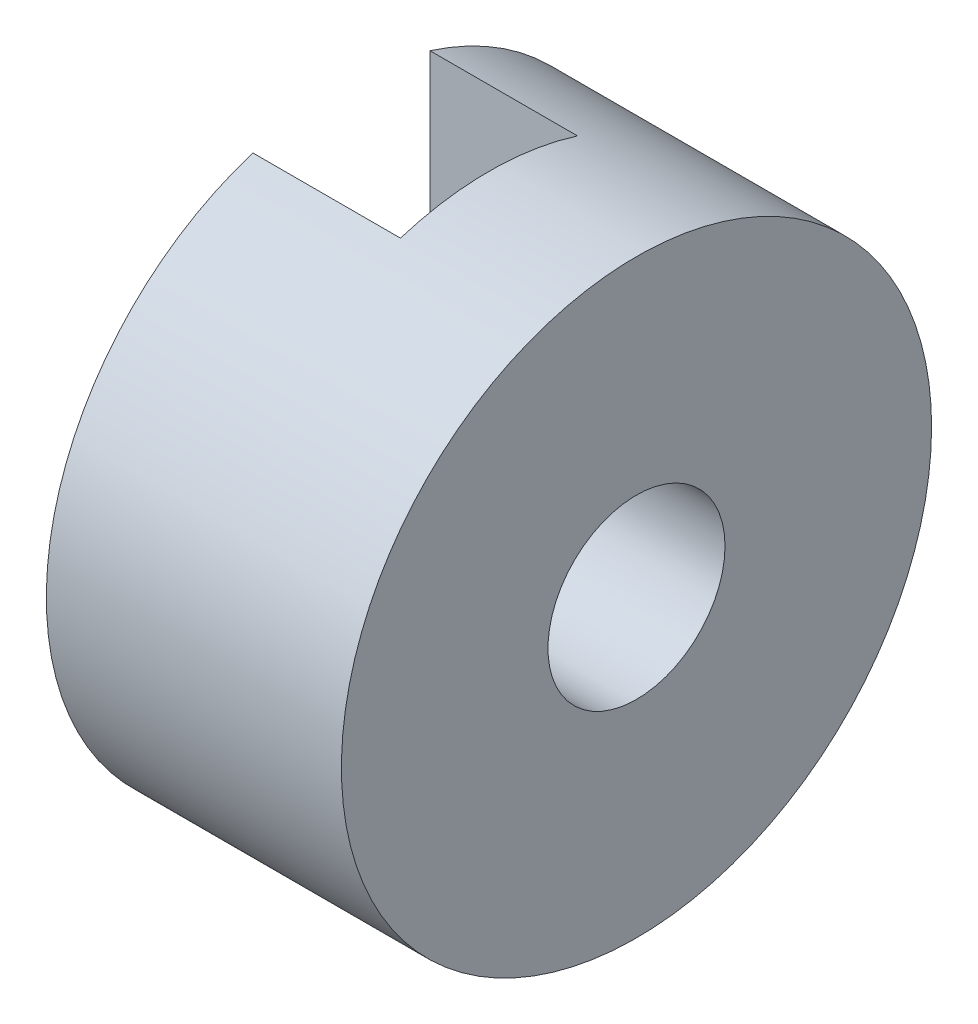
ISO-10303-21;
HEADER;
FILE_DESCRIPTION(('STEP AP214'),'2;1');
FILE_NAME('part.step','',(''),(''),'','','');
FILE_SCHEMA(('AUTOMOTIVE_DESIGN { 1 0 10303 214 1 1 1 1 }'));
ENDSEC;
DATA;
#1=APPLICATION_CONTEXT('core data for automotive mechanical design processes');
#2=APPLICATION_PROTOCOL_DEFINITION('international standard','automotive_design',2000,#1);
#3=PRODUCT_CONTEXT('',#1,'mechanical');
#4=PRODUCT('Part','Part','',(#3));
#5=PRODUCT_RELATED_PRODUCT_CATEGORY('part','',(#4));
#6=PRODUCT_DEFINITION_FORMATION('','',#4);
#7=PRODUCT_DEFINITION_CONTEXT('part definition',#1,'design');
#8=PRODUCT_DEFINITION('design','',#6,#7);
#9=PRODUCT_DEFINITION_SHAPE('','',#8);
#10=(LENGTH_UNIT() NAMED_UNIT(*) SI_UNIT(.MILLI.,.METRE.));
#11=(NAMED_UNIT(*) PLANE_ANGLE_UNIT() SI_UNIT($,.RADIAN.));
#12=(NAMED_UNIT(*) SI_UNIT($,.STERADIAN.) SOLID_ANGLE_UNIT());
#13=UNCERTAINTY_MEASURE_WITH_UNIT(LENGTH_MEASURE(1.E-05),#10,'distance_accuracy_value','');
#14=(GEOMETRIC_REPRESENTATION_CONTEXT(3) GLOBAL_UNCERTAINTY_ASSIGNED_CONTEXT((#13)) GLOBAL_UNIT_ASSIGNED_CONTEXT((#10,
#11,#12)) REPRESENTATION_CONTEXT('',''));
#15=CARTESIAN_POINT('',(0.,0.,0.));
#16=DIRECTION('',(0.,0.,1.));
#17=DIRECTION('',(1.,0.,0.));
#18=AXIS2_PLACEMENT_3D('',#15,#16,#17);
#19=CARTESIAN_POINT('',(10.,0.,0.));
#20=DIRECTION('',(1.,0.,0.));
#21=DIRECTION('',(0.,0.,-1.));
#22=AXIS2_PLACEMENT_3D('',#19,#20,#21);
#23=PLANE('',#22);
#24=CARTESIAN_POINT('',(10.,0.,0.));
#25=DIRECTION('',(1.,0.,0.));
#26=DIRECTION('',(0.,0.,-1.));
#27=AXIS2_PLACEMENT_3D('',#24,#25,#26);
#28=CIRCLE('',#27,10.);
#29=CARTESIAN_POINT('',(10.,0.,-10.));
#30=VERTEX_POINT('',#29);
#31=EDGE_CURVE('E52',#30,#30,#28,.T.);
#32=ORIENTED_EDGE('',*,*,#31,.T.);
#33=EDGE_LOOP('',(#32));
#34=FACE_BOUND('',#33,.T.);
#35=CARTESIAN_POINT('',(10.,0.,0.));
#36=DIRECTION('',(1.,0.,0.));
#37=DIRECTION('',(0.,0.,-1.));
#38=AXIS2_PLACEMENT_3D('',#35,#36,#37);
#39=CIRCLE('',#38,3.);
#40=CARTESIAN_POINT('',(10.,0.,-3.));
#41=VERTEX_POINT('',#40);
#42=EDGE_CURVE('E118',#41,#41,#39,.T.);
#43=ORIENTED_EDGE('',*,*,#42,.F.);
#44=EDGE_LOOP('',(#43));
#45=FACE_BOUND('',#44,.T.);
#46=ADVANCED_FACE('F43',(#34,#45),#23,.T.);
#47=CARTESIAN_POINT('',(0.,0.,0.));
#48=DIRECTION('',(1.,0.,0.));
#49=DIRECTION('',(0.,0.,-1.));
#50=AXIS2_PLACEMENT_3D('',#47,#48,#49);
#51=PLANE('',#50);
#52=CARTESIAN_POINT('',(0.,0.,0.));
#53=DIRECTION('',(1.,0.,0.));
#54=DIRECTION('',(0.,0.,-1.));
#55=AXIS2_PLACEMENT_3D('',#52,#53,#54);
#56=CIRCLE('',#55,10.);
#57=CARTESIAN_POINT('',(0.,9.53939201416946,3.));
#58=VERTEX_POINT('',#57);
#59=CARTESIAN_POINT('',(0.,9.53939201416946,-3.));
#60=VERTEX_POINT('',#59);
#61=EDGE_CURVE('E122',#58,#60,#56,.T.);
#62=ORIENTED_EDGE('',*,*,#61,.F.);
#63=DIRECTION('',(0.,1.,0.));
#64=VECTOR('',#63,1.);
#65=CARTESIAN_POINT('',(0.,10.,3.));
#66=LINE('',#65,#64);
#67=CARTESIAN_POINT('',(0.,0.,3.));
#68=VERTEX_POINT('',#67);
#69=EDGE_CURVE('E110',#68,#58,#66,.T.);
#70=ORIENTED_EDGE('',*,*,#69,.F.);
#71=CARTESIAN_POINT('',(0.,0.,0.));
#72=DIRECTION('',(1.,0.,0.));
#73=DIRECTION('',(0.,0.,-1.));
#74=AXIS2_PLACEMENT_3D('',#71,#72,#73);
#75=CIRCLE('',#74,3.);
#76=CARTESIAN_POINT('',(0.,0.,-3.));
#77=VERTEX_POINT('',#76);
#78=EDGE_CURVE('E101',#68,#77,#75,.T.);
#79=ORIENTED_EDGE('',*,*,#78,.T.);
#80=DIRECTION('',(0.,-1.,0.));
#81=VECTOR('',#80,1.);
#82=CARTESIAN_POINT('',(0.,10.,-3.));
#83=LINE('',#82,#81);
#84=EDGE_CURVE('E134',#60,#77,#83,.T.);
#85=ORIENTED_EDGE('',*,*,#84,.F.);
#86=EDGE_LOOP('',(#62,#70,#79,#85));
#87=FACE_BOUND('',#86,.T.);
#88=ADVANCED_FACE('F133',(#87),#51,.F.);
#89=CARTESIAN_POINT('',(10.,0.,0.));
#90=DIRECTION('',(-1.,0.,0.));
#91=DIRECTION('',(0.,0.,1.));
#92=AXIS2_PLACEMENT_3D('',#89,#90,#91);
#93=CYLINDRICAL_SURFACE('',#92,10.);
#94=ORIENTED_EDGE('',*,*,#31,.F.);
#95=EDGE_LOOP('',(#94));
#96=FACE_BOUND('',#95,.T.);
#97=CARTESIAN_POINT('',(5.,0.,0.));
#98=DIRECTION('',(-1.,0.,0.));
#99=DIRECTION('',(0.,0.,1.));
#100=AXIS2_PLACEMENT_3D('',#97,#98,#99);
#101=CIRCLE('',#100,10.);
#102=CARTESIAN_POINT('',(5.,9.53939201416946,3.));
#103=VERTEX_POINT('',#102);
#104=CARTESIAN_POINT('',(5.,9.53939201416946,-3.));
#105=VERTEX_POINT('',#104);
#106=EDGE_CURVE('E66',#103,#105,#101,.T.);
#107=ORIENTED_EDGE('',*,*,#106,.F.);
#108=DIRECTION('',(-1.,0.,0.));
#109=VECTOR('',#108,1.);
#110=CARTESIAN_POINT('',(10.,9.53939201416946,3.));
#111=LINE('',#110,#109);
#112=EDGE_CURVE('E94',#103,#58,#111,.T.);
#113=ORIENTED_EDGE('',*,*,#112,.T.);
#114=ORIENTED_EDGE('',*,*,#61,.T.);
#115=DIRECTION('',(-1.,0.,0.));
#116=VECTOR('',#115,1.);
#117=CARTESIAN_POINT('',(10.,9.53939201416946,-3.));
#118=LINE('',#117,#116);
#119=EDGE_CURVE('E106',#60,#105,#118,.F.);
#120=ORIENTED_EDGE('',*,*,#119,.T.);
#121=EDGE_LOOP('',(#107,#113,#114,#120));
#122=FACE_BOUND('',#121,.T.);
#123=ADVANCED_FACE('F45',(#96,#122),#93,.T.);
#124=CARTESIAN_POINT('',(10.,0.,0.));
#125=DIRECTION('',(-1.,0.,0.));
#126=DIRECTION('',(0.,0.,1.));
#127=AXIS2_PLACEMENT_3D('',#124,#125,#126);
#128=CYLINDRICAL_SURFACE('',#127,3.);
#129=DIRECTION('',(-1.,0.,0.));
#130=VECTOR('',#129,1.);
#131=CARTESIAN_POINT('',(5.,0.,3.));
#132=LINE('',#131,#130);
#133=CARTESIAN_POINT('',(5.,0.,3.));
#134=VERTEX_POINT('',#133);
#135=EDGE_CURVE('E91',#134,#68,#132,.T.);
#136=ORIENTED_EDGE('',*,*,#135,.F.);
#137=CARTESIAN_POINT('',(5.,0.,0.));
#138=DIRECTION('',(-1.,0.,0.));
#139=DIRECTION('',(0.,0.,1.));
#140=AXIS2_PLACEMENT_3D('',#137,#138,#139);
#141=CIRCLE('',#140,3.);
#142=CARTESIAN_POINT('',(5.,0.,-3.));
#143=VERTEX_POINT('',#142);
#144=EDGE_CURVE('E11',#134,#143,#141,.T.);
#145=ORIENTED_EDGE('',*,*,#144,.T.);
#146=DIRECTION('',(-1.,0.,0.));
#147=VECTOR('',#146,1.);
#148=CARTESIAN_POINT('',(5.,0.,-3.));
#149=LINE('',#148,#147);
#150=EDGE_CURVE('E59',#143,#77,#149,.T.);
#151=ORIENTED_EDGE('',*,*,#150,.T.);
#152=ORIENTED_EDGE('',*,*,#78,.F.);
#153=EDGE_LOOP('',(#136,#145,#151,#152));
#154=FACE_BOUND('',#153,.T.);
#155=ORIENTED_EDGE('',*,*,#42,.T.);
#156=EDGE_LOOP('',(#155));
#157=FACE_BOUND('',#156,.T.);
#158=ADVANCED_FACE('F98',(#154,#157),#128,.F.);
#159=CARTESIAN_POINT('',(5.,10.,3.));
#160=DIRECTION('',(0.,0.,1.));
#161=DIRECTION('',(0.,-1.,0.));
#162=AXIS2_PLACEMENT_3D('',#159,#160,#161);
#163=PLANE('',#162);
#164=DIRECTION('',(0.,1.,0.));
#165=VECTOR('',#164,1.);
#166=CARTESIAN_POINT('',(5.,10.,3.));
#167=LINE('',#166,#165);
#168=EDGE_CURVE('E85',#134,#103,#167,.T.);
#169=ORIENTED_EDGE('',*,*,#168,.F.);
#170=ORIENTED_EDGE('',*,*,#135,.T.);
#171=ORIENTED_EDGE('',*,*,#69,.T.);
#172=ORIENTED_EDGE('',*,*,#112,.F.);
#173=EDGE_LOOP('',(#169,#170,#171,#172));
#174=FACE_BOUND('',#173,.T.);
#175=ADVANCED_FACE('F90',(#174),#163,.F.);
#176=CARTESIAN_POINT('',(5.,10.,-3.));
#177=DIRECTION('',(0.,0.,-1.));
#178=DIRECTION('',(0.,1.,0.));
#179=AXIS2_PLACEMENT_3D('',#176,#177,#178);
#180=PLANE('',#179);
#181=ORIENTED_EDGE('',*,*,#84,.T.);
#182=ORIENTED_EDGE('',*,*,#150,.F.);
#183=DIRECTION('',(0.,-1.,0.));
#184=VECTOR('',#183,1.);
#185=CARTESIAN_POINT('',(5.,10.,-3.));
#186=LINE('',#185,#184);
#187=EDGE_CURVE('E86',#105,#143,#186,.T.);
#188=ORIENTED_EDGE('',*,*,#187,.F.);
#189=ORIENTED_EDGE('',*,*,#119,.F.);
#190=EDGE_LOOP('',(#181,#182,#188,#189));
#191=FACE_BOUND('',#190,.T.);
#192=ADVANCED_FACE('F139',(#191),#180,.F.);
#193=CARTESIAN_POINT('',(5.,10.,0.));
#194=DIRECTION('',(-1.,0.,0.));
#195=DIRECTION('',(0.,0.,1.));
#196=AXIS2_PLACEMENT_3D('',#193,#194,#195);
#197=PLANE('',#196);
#198=ORIENTED_EDGE('',*,*,#106,.T.);
#199=ORIENTED_EDGE('',*,*,#187,.T.);
#200=ORIENTED_EDGE('',*,*,#144,.F.);
#201=ORIENTED_EDGE('',*,*,#168,.T.);
#202=EDGE_LOOP('',(#198,#199,#200,#201));
#203=FACE_BOUND('',#202,.T.);
#204=ADVANCED_FACE('F84',(#203),#197,.T.);
#205=CLOSED_SHELL('',(#46,#88,#123,#158,#175,#192,#204));
#206=MANIFOLD_SOLID_BREP('B2',#205);
#207=ADVANCED_BREP_SHAPE_REPRESENTATION('',(#18,#206),#14);
#208=SHAPE_DEFINITION_REPRESENTATION(#9,#207);
ENDSEC;
END-ISO-10303-21;
